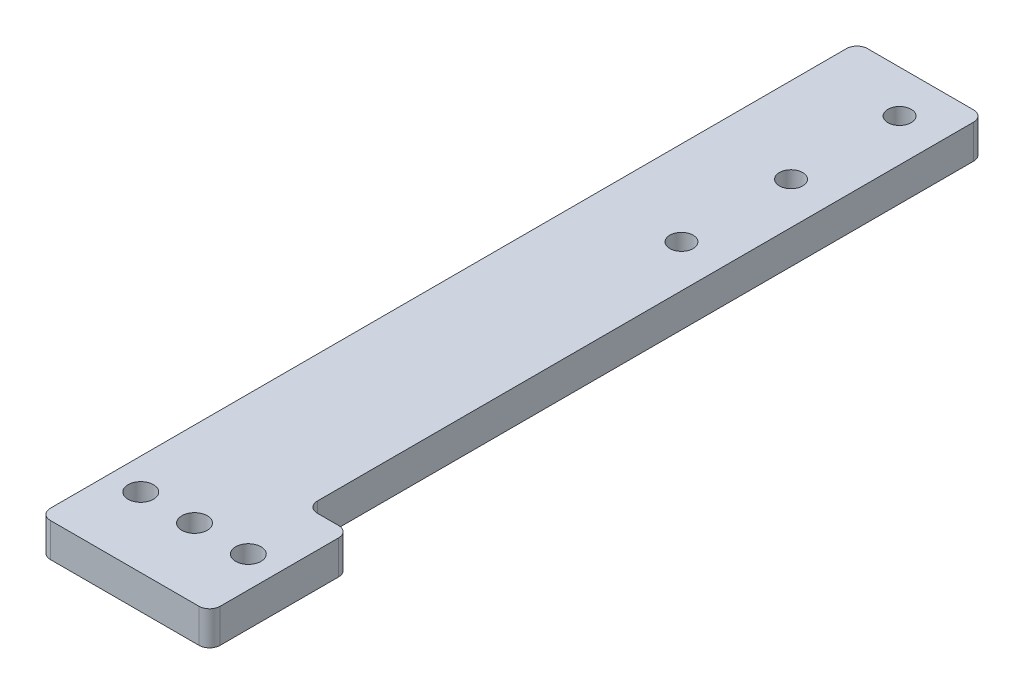
ISO-10303-21;
HEADER;
FILE_DESCRIPTION(('STEP AP214'),'2;1');
FILE_NAME('part.step','',(''),(''),'','','');
FILE_SCHEMA(('AUTOMOTIVE_DESIGN { 1 0 10303 214 1 1 1 1 }'));
ENDSEC;
DATA;
#1=APPLICATION_CONTEXT('core data for automotive mechanical design processes');
#2=APPLICATION_PROTOCOL_DEFINITION('international standard','automotive_design',2000,#1);
#3=PRODUCT_CONTEXT('',#1,'mechanical');
#4=PRODUCT('Part','Part','',(#3));
#5=PRODUCT_RELATED_PRODUCT_CATEGORY('part','',(#4));
#6=PRODUCT_DEFINITION_FORMATION('','',#4);
#7=PRODUCT_DEFINITION_CONTEXT('part definition',#1,'design');
#8=PRODUCT_DEFINITION('design','',#6,#7);
#9=PRODUCT_DEFINITION_SHAPE('','',#8);
#10=(LENGTH_UNIT() NAMED_UNIT(*) SI_UNIT(.MILLI.,.METRE.));
#11=(NAMED_UNIT(*) PLANE_ANGLE_UNIT() SI_UNIT($,.RADIAN.));
#12=(NAMED_UNIT(*) SI_UNIT($,.STERADIAN.) SOLID_ANGLE_UNIT());
#13=UNCERTAINTY_MEASURE_WITH_UNIT(LENGTH_MEASURE(1.E-05),#10,'distance_accuracy_value','');
#14=(GEOMETRIC_REPRESENTATION_CONTEXT(3) GLOBAL_UNCERTAINTY_ASSIGNED_CONTEXT((#13)) GLOBAL_UNIT_ASSIGNED_CONTEXT((#10,
#11,#12)) REPRESENTATION_CONTEXT('',''));
#15=CARTESIAN_POINT('',(0.,0.,0.));
#16=DIRECTION('',(0.,0.,1.));
#17=DIRECTION('',(1.,0.,0.));
#18=AXIS2_PLACEMENT_3D('',#15,#16,#17);
#19=CARTESIAN_POINT('',(0.,1.6,0.));
#20=DIRECTION('',(0.,-1.,0.));
#21=DIRECTION('',(0.,0.,-1.));
#22=AXIS2_PLACEMENT_3D('',#19,#20,#21);
#23=PLANE('',#22);
#24=CARTESIAN_POINT('',(2.54,1.6,19.3));
#25=DIRECTION('',(0.,1.,0.));
#26=DIRECTION('',(0.,0.,-1.));
#27=AXIS2_PLACEMENT_3D('',#24,#25,#26);
#28=CIRCLE('',#27,0.6);
#29=CARTESIAN_POINT('',(2.54,1.6,18.7));
#30=VERTEX_POINT('',#29);
#31=EDGE_CURVE('E359',#30,#30,#28,.T.);
#32=ORIENTED_EDGE('',*,*,#31,.F.);
#33=EDGE_LOOP('',(#32));
#34=FACE_BOUND('',#33,.T.);
#35=CARTESIAN_POINT('',(-2.54,1.6,19.3));
#36=DIRECTION('',(0.,1.,0.));
#37=DIRECTION('',(0.,0.,1.));
#38=AXIS2_PLACEMENT_3D('',#35,#36,#37);
#39=CIRCLE('',#38,0.6);
#40=CARTESIAN_POINT('',(-2.54,1.6,19.9));
#41=VERTEX_POINT('',#40);
#42=EDGE_CURVE('E350',#41,#41,#39,.T.);
#43=ORIENTED_EDGE('',*,*,#42,.F.);
#44=EDGE_LOOP('',(#43));
#45=FACE_BOUND('',#44,.T.);
#46=CARTESIAN_POINT('',(0.,1.6,19.3));
#47=DIRECTION('',(0.,1.,0.));
#48=DIRECTION('',(0.,0.,1.));
#49=AXIS2_PLACEMENT_3D('',#46,#47,#48);
#50=CIRCLE('',#49,0.6);
#51=CARTESIAN_POINT('',(0.,1.6,19.9));
#52=VERTEX_POINT('',#51);
#53=EDGE_CURVE('E356',#52,#52,#50,.T.);
#54=ORIENTED_EDGE('',*,*,#53,.F.);
#55=EDGE_LOOP('',(#54));
#56=FACE_BOUND('',#55,.T.);
#57=DIRECTION('',(-1.,0.,0.));
#58=VECTOR('',#57,1.);
#59=CARTESIAN_POINT('',(-2.,1.6,-16.));
#60=LINE('',#59,#58);
#61=CARTESIAN_POINT('',(1.5,1.6,-16.));
#62=VERTEX_POINT('',#61);
#63=CARTESIAN_POINT('',(-3.51,1.6,-16.));
#64=VERTEX_POINT('',#63);
#65=EDGE_CURVE('E202',#62,#64,#60,.T.);
#66=ORIENTED_EDGE('',*,*,#65,.T.);
#67=CARTESIAN_POINT('',(-3.51,1.6,-15.5));
#68=DIRECTION('',(0.,-1.,0.));
#69=DIRECTION('',(0.,0.,-1.));
#70=AXIS2_PLACEMENT_3D('',#67,#68,#69);
#71=CIRCLE('',#70,0.5);
#72=CARTESIAN_POINT('',(-4.01,1.6,-15.5));
#73=VERTEX_POINT('',#72);
#74=EDGE_CURVE('E240',#64,#73,#71,.F.);
#75=ORIENTED_EDGE('',*,*,#74,.T.);
#76=DIRECTION('',(0.,0.,1.));
#77=VECTOR('',#76,1.);
#78=CARTESIAN_POINT('',(-4.01,1.6,22.6));
#79=LINE('',#78,#77);
#80=CARTESIAN_POINT('',(-4.01,1.6,22.1));
#81=VERTEX_POINT('',#80);
#82=EDGE_CURVE('E151',#73,#81,#79,.T.);
#83=ORIENTED_EDGE('',*,*,#82,.T.);
#84=CARTESIAN_POINT('',(-3.51,1.6,22.1));
#85=DIRECTION('',(0.,-1.,0.));
#86=DIRECTION('',(0.,0.,-1.));
#87=AXIS2_PLACEMENT_3D('',#84,#85,#86);
#88=CIRCLE('',#87,0.5);
#89=CARTESIAN_POINT('',(-3.51,1.6,22.6));
#90=VERTEX_POINT('',#89);
#91=EDGE_CURVE('E237',#81,#90,#88,.F.);
#92=ORIENTED_EDGE('',*,*,#91,.T.);
#93=DIRECTION('',(1.,0.,0.));
#94=VECTOR('',#93,1.);
#95=CARTESIAN_POINT('',(4.01,1.6,22.6));
#96=LINE('',#95,#94);
#97=CARTESIAN_POINT('',(3.51,1.6,22.6));
#98=VERTEX_POINT('',#97);
#99=EDGE_CURVE('E181',#90,#98,#96,.T.);
#100=ORIENTED_EDGE('',*,*,#99,.T.);
#101=CARTESIAN_POINT('',(3.51,1.6,22.1));
#102=DIRECTION('',(0.,-1.,0.));
#103=DIRECTION('',(0.,0.,-1.));
#104=AXIS2_PLACEMENT_3D('',#101,#102,#103);
#105=CIRCLE('',#104,0.5);
#106=CARTESIAN_POINT('',(4.01,1.6,22.1));
#107=VERTEX_POINT('',#106);
#108=EDGE_CURVE('E234',#98,#107,#105,.F.);
#109=ORIENTED_EDGE('',*,*,#108,.T.);
#110=DIRECTION('',(0.,0.,-1.));
#111=VECTOR('',#110,1.);
#112=CARTESIAN_POINT('',(4.01,1.6,22.6));
#113=LINE('',#112,#111);
#114=CARTESIAN_POINT('',(4.01,1.6,16.5));
#115=VERTEX_POINT('',#114);
#116=EDGE_CURVE('E166',#107,#115,#113,.T.);
#117=ORIENTED_EDGE('',*,*,#116,.T.);
#118=CARTESIAN_POINT('',(3.51,1.6,16.5));
#119=DIRECTION('',(0.,-1.,0.));
#120=DIRECTION('',(0.,0.,-1.));
#121=AXIS2_PLACEMENT_3D('',#118,#119,#120);
#122=CIRCLE('',#121,0.5);
#123=CARTESIAN_POINT('',(3.51,1.6,16.));
#124=VERTEX_POINT('',#123);
#125=EDGE_CURVE('E62',#115,#124,#122,.F.);
#126=ORIENTED_EDGE('',*,*,#125,.T.);
#127=DIRECTION('',(-1.,0.,0.));
#128=VECTOR('',#127,1.);
#129=CARTESIAN_POINT('',(4.01,1.6,16.));
#130=LINE('',#129,#128);
#131=CARTESIAN_POINT('',(2.5,1.6,16.));
#132=VERTEX_POINT('',#131);
#133=EDGE_CURVE('E281',#124,#132,#130,.T.);
#134=ORIENTED_EDGE('',*,*,#133,.T.);
#135=CARTESIAN_POINT('',(2.5,1.6,15.5));
#136=DIRECTION('',(0.,-1.,0.));
#137=DIRECTION('',(0.,0.,-1.));
#138=AXIS2_PLACEMENT_3D('',#135,#136,#137);
#139=CIRCLE('',#138,0.5);
#140=CARTESIAN_POINT('',(2.,1.6,15.5));
#141=VERTEX_POINT('',#140);
#142=EDGE_CURVE('E11',#132,#141,#139,.T.);
#143=ORIENTED_EDGE('',*,*,#142,.T.);
#144=DIRECTION('',(0.,0.,-1.));
#145=VECTOR('',#144,1.);
#146=CARTESIAN_POINT('',(2.,1.6,16.));
#147=LINE('',#146,#145);
#148=CARTESIAN_POINT('',(2.,1.6,-15.5));
#149=VERTEX_POINT('',#148);
#150=EDGE_CURVE('E198',#141,#149,#147,.T.);
#151=ORIENTED_EDGE('',*,*,#150,.T.);
#152=CARTESIAN_POINT('',(1.5,1.6,-15.5));
#153=DIRECTION('',(0.,-1.,0.));
#154=DIRECTION('',(0.,0.,-1.));
#155=AXIS2_PLACEMENT_3D('',#152,#153,#154);
#156=CIRCLE('',#155,0.5);
#157=EDGE_CURVE('E229',#149,#62,#156,.F.);
#158=ORIENTED_EDGE('',*,*,#157,.T.);
#159=EDGE_LOOP('',(#66,#75,#83,#92,#100,#109,#117,#126,#134,#143,#151,#158));
#160=FACE_BOUND('',#159,.T.);
#161=CARTESIAN_POINT('',(0.0240948858415333,1.6,-8.85005636569911));
#162=DIRECTION('',(0.,1.,0.));
#163=DIRECTION('',(0.,0.,1.));
#164=AXIS2_PLACEMENT_3D('',#161,#162,#163);
#165=CIRCLE('',#164,0.55);
#166=CARTESIAN_POINT('',(0.0240948858415333,1.6,-8.30005636569911));
#167=VERTEX_POINT('',#166);
#168=EDGE_CURVE('E190',#167,#167,#165,.T.);
#169=ORIENTED_EDGE('',*,*,#168,.F.);
#170=EDGE_LOOP('',(#169));
#171=FACE_BOUND('',#170,.T.);
#172=CARTESIAN_POINT('',(0.,1.6,-14.));
#173=DIRECTION('',(0.,1.,0.));
#174=DIRECTION('',(0.,0.,1.));
#175=AXIS2_PLACEMENT_3D('',#172,#173,#174);
#176=CIRCLE('',#175,0.55);
#177=CARTESIAN_POINT('',(0.,1.6,-13.45));
#178=VERTEX_POINT('',#177);
#179=EDGE_CURVE('E182',#178,#178,#176,.T.);
#180=ORIENTED_EDGE('',*,*,#179,.F.);
#181=EDGE_LOOP('',(#180));
#182=FACE_BOUND('',#181,.T.);
#183=CARTESIAN_POINT('',(0.,1.6,-3.70011273139822));
#184=DIRECTION('',(0.,1.,0.));
#185=DIRECTION('',(0.,0.,-1.));
#186=AXIS2_PLACEMENT_3D('',#183,#184,#185);
#187=CIRCLE('',#186,0.55);
#188=CARTESIAN_POINT('',(0.,1.6,-4.25011273139822));
#189=VERTEX_POINT('',#188);
#190=EDGE_CURVE('E172',#189,#189,#187,.T.);
#191=ORIENTED_EDGE('',*,*,#190,.F.);
#192=EDGE_LOOP('',(#191));
#193=FACE_BOUND('',#192,.T.);
#194=ADVANCED_FACE('F39',(#34,#45,#56,#160,#171,#182,#193),#23,.F.);
#195=CARTESIAN_POINT('',(0.,0.,0.));
#196=DIRECTION('',(0.,-1.,0.));
#197=DIRECTION('',(0.,0.,-1.));
#198=AXIS2_PLACEMENT_3D('',#195,#196,#197);
#199=PLANE('',#198);
#200=CARTESIAN_POINT('',(2.54,0.,19.3));
#201=DIRECTION('',(0.,1.,0.));
#202=DIRECTION('',(0.,0.,-1.));
#203=AXIS2_PLACEMENT_3D('',#200,#201,#202);
#204=CIRCLE('',#203,0.6);
#205=CARTESIAN_POINT('',(2.54,0.,18.7));
#206=VERTEX_POINT('',#205);
#207=EDGE_CURVE('E352',#206,#206,#204,.T.);
#208=ORIENTED_EDGE('',*,*,#207,.T.);
#209=EDGE_LOOP('',(#208));
#210=FACE_BOUND('',#209,.T.);
#211=CARTESIAN_POINT('',(-2.54,0.,19.3));
#212=DIRECTION('',(0.,1.,0.));
#213=DIRECTION('',(0.,0.,1.));
#214=AXIS2_PLACEMENT_3D('',#211,#212,#213);
#215=CIRCLE('',#214,0.6);
#216=CARTESIAN_POINT('',(-2.54,0.,19.9));
#217=VERTEX_POINT('',#216);
#218=EDGE_CURVE('E347',#217,#217,#215,.T.);
#219=ORIENTED_EDGE('',*,*,#218,.T.);
#220=EDGE_LOOP('',(#219));
#221=FACE_BOUND('',#220,.T.);
#222=CARTESIAN_POINT('',(0.,0.,19.3));
#223=DIRECTION('',(0.,1.,0.));
#224=DIRECTION('',(0.,0.,1.));
#225=AXIS2_PLACEMENT_3D('',#222,#223,#224);
#226=CIRCLE('',#225,0.6);
#227=CARTESIAN_POINT('',(0.,0.,19.9));
#228=VERTEX_POINT('',#227);
#229=EDGE_CURVE('E365',#228,#228,#226,.T.);
#230=ORIENTED_EDGE('',*,*,#229,.T.);
#231=EDGE_LOOP('',(#230));
#232=FACE_BOUND('',#231,.T.);
#233=CARTESIAN_POINT('',(0.,0.,-14.));
#234=DIRECTION('',(0.,1.,0.));
#235=DIRECTION('',(0.,0.,1.));
#236=AXIS2_PLACEMENT_3D('',#233,#234,#235);
#237=CIRCLE('',#236,0.55);
#238=CARTESIAN_POINT('',(0.,0.,-13.45));
#239=VERTEX_POINT('',#238);
#240=EDGE_CURVE('E176',#239,#239,#237,.T.);
#241=ORIENTED_EDGE('',*,*,#240,.T.);
#242=EDGE_LOOP('',(#241));
#243=FACE_BOUND('',#242,.T.);
#244=DIRECTION('',(0.,0.,1.));
#245=VECTOR('',#244,1.);
#246=CARTESIAN_POINT('',(-4.01,0.,22.6));
#247=LINE('',#246,#245);
#248=CARTESIAN_POINT('',(-4.01,0.,-15.5));
#249=VERTEX_POINT('',#248);
#250=CARTESIAN_POINT('',(-4.01,0.,22.1));
#251=VERTEX_POINT('',#250);
#252=EDGE_CURVE('E148',#249,#251,#247,.T.);
#253=ORIENTED_EDGE('',*,*,#252,.F.);
#254=CARTESIAN_POINT('',(-3.51,0.,-15.5));
#255=DIRECTION('',(0.,-1.,0.));
#256=DIRECTION('',(0.,0.,-1.));
#257=AXIS2_PLACEMENT_3D('',#254,#255,#256);
#258=CIRCLE('',#257,0.5);
#259=CARTESIAN_POINT('',(-3.51,0.,-16.));
#260=VERTEX_POINT('',#259);
#261=EDGE_CURVE('E130',#249,#260,#258,.T.);
#262=ORIENTED_EDGE('',*,*,#261,.T.);
#263=DIRECTION('',(-1.,0.,0.));
#264=VECTOR('',#263,1.);
#265=CARTESIAN_POINT('',(-2.,0.,-16.));
#266=LINE('',#265,#264);
#267=CARTESIAN_POINT('',(1.5,0.,-16.));
#268=VERTEX_POINT('',#267);
#269=EDGE_CURVE('E203',#268,#260,#266,.T.);
#270=ORIENTED_EDGE('',*,*,#269,.F.);
#271=CARTESIAN_POINT('',(1.5,0.,-15.5));
#272=DIRECTION('',(0.,-1.,0.));
#273=DIRECTION('',(0.,0.,-1.));
#274=AXIS2_PLACEMENT_3D('',#271,#272,#273);
#275=CIRCLE('',#274,0.5);
#276=CARTESIAN_POINT('',(2.,0.,-15.5));
#277=VERTEX_POINT('',#276);
#278=EDGE_CURVE('E153',#268,#277,#275,.T.);
#279=ORIENTED_EDGE('',*,*,#278,.T.);
#280=DIRECTION('',(0.,0.,-1.));
#281=VECTOR('',#280,1.);
#282=CARTESIAN_POINT('',(2.,0.,16.));
#283=LINE('',#282,#281);
#284=CARTESIAN_POINT('',(2.,0.,15.5));
#285=VERTEX_POINT('',#284);
#286=EDGE_CURVE('E194',#285,#277,#283,.T.);
#287=ORIENTED_EDGE('',*,*,#286,.F.);
#288=CARTESIAN_POINT('',(2.5,0.,15.5));
#289=DIRECTION('',(0.,-1.,0.));
#290=DIRECTION('',(0.,0.,-1.));
#291=AXIS2_PLACEMENT_3D('',#288,#289,#290);
#292=CIRCLE('',#291,0.5);
#293=CARTESIAN_POINT('',(2.5,0.,16.));
#294=VERTEX_POINT('',#293);
#295=EDGE_CURVE('E48',#285,#294,#292,.F.);
#296=ORIENTED_EDGE('',*,*,#295,.T.);
#297=DIRECTION('',(-1.,0.,0.));
#298=VECTOR('',#297,1.);
#299=CARTESIAN_POINT('',(4.01,0.,16.));
#300=LINE('',#299,#298);
#301=CARTESIAN_POINT('',(3.51,0.,16.));
#302=VERTEX_POINT('',#301);
#303=EDGE_CURVE('E161',#302,#294,#300,.T.);
#304=ORIENTED_EDGE('',*,*,#303,.F.);
#305=CARTESIAN_POINT('',(3.51,0.,16.5));
#306=DIRECTION('',(0.,-1.,0.));
#307=DIRECTION('',(0.,0.,-1.));
#308=AXIS2_PLACEMENT_3D('',#305,#306,#307);
#309=CIRCLE('',#308,0.5);
#310=CARTESIAN_POINT('',(4.01,0.,16.5));
#311=VERTEX_POINT('',#310);
#312=EDGE_CURVE('E216',#302,#311,#309,.T.);
#313=ORIENTED_EDGE('',*,*,#312,.T.);
#314=DIRECTION('',(0.,0.,-1.));
#315=VECTOR('',#314,1.);
#316=CARTESIAN_POINT('',(4.01,0.,22.6));
#317=LINE('',#316,#315);
#318=CARTESIAN_POINT('',(4.01,0.,22.1));
#319=VERTEX_POINT('',#318);
#320=EDGE_CURVE('E168',#319,#311,#317,.T.);
#321=ORIENTED_EDGE('',*,*,#320,.F.);
#322=CARTESIAN_POINT('',(3.51,0.,22.1));
#323=DIRECTION('',(0.,-1.,0.));
#324=DIRECTION('',(0.,0.,-1.));
#325=AXIS2_PLACEMENT_3D('',#322,#323,#324);
#326=CIRCLE('',#325,0.5);
#327=CARTESIAN_POINT('',(3.51,0.,22.6));
#328=VERTEX_POINT('',#327);
#329=EDGE_CURVE('E219',#319,#328,#326,.T.);
#330=ORIENTED_EDGE('',*,*,#329,.T.);
#331=DIRECTION('',(1.,0.,0.));
#332=VECTOR('',#331,1.);
#333=CARTESIAN_POINT('',(4.01,0.,22.6));
#334=LINE('',#333,#332);
#335=CARTESIAN_POINT('',(-3.51,0.,22.6));
#336=VERTEX_POINT('',#335);
#337=EDGE_CURVE('E160',#336,#328,#334,.T.);
#338=ORIENTED_EDGE('',*,*,#337,.F.);
#339=CARTESIAN_POINT('',(-3.51,0.,22.1));
#340=DIRECTION('',(0.,-1.,0.));
#341=DIRECTION('',(0.,0.,-1.));
#342=AXIS2_PLACEMENT_3D('',#339,#340,#341);
#343=CIRCLE('',#342,0.5);
#344=EDGE_CURVE('E142',#336,#251,#343,.T.);
#345=ORIENTED_EDGE('',*,*,#344,.T.);
#346=EDGE_LOOP('',(#253,#262,#270,#279,#287,#296,#304,#313,#321,#330,#338,#345));
#347=FACE_BOUND('',#346,.T.);
#348=CARTESIAN_POINT('',(0.0240948858415333,0.,-8.85005636569911));
#349=DIRECTION('',(0.,1.,0.));
#350=DIRECTION('',(0.,0.,1.));
#351=AXIS2_PLACEMENT_3D('',#348,#349,#350);
#352=CIRCLE('',#351,0.55);
#353=CARTESIAN_POINT('',(0.0240948858415333,0.,-8.30005636569911));
#354=VERTEX_POINT('',#353);
#355=EDGE_CURVE('E186',#354,#354,#352,.T.);
#356=ORIENTED_EDGE('',*,*,#355,.T.);
#357=EDGE_LOOP('',(#356));
#358=FACE_BOUND('',#357,.T.);
#359=CARTESIAN_POINT('',(0.,0.,-3.70011273139822));
#360=DIRECTION('',(0.,1.,0.));
#361=DIRECTION('',(0.,0.,-1.));
#362=AXIS2_PLACEMENT_3D('',#359,#360,#361);
#363=CIRCLE('',#362,0.55);
#364=CARTESIAN_POINT('',(0.,0.,-4.25011273139822));
#365=VERTEX_POINT('',#364);
#366=EDGE_CURVE('E177',#365,#365,#363,.T.);
#367=ORIENTED_EDGE('',*,*,#366,.T.);
#368=EDGE_LOOP('',(#367));
#369=FACE_BOUND('',#368,.T.);
#370=ADVANCED_FACE('F156',(#210,#221,#232,#243,#347,#358,#369),#199,.T.);
#371=CARTESIAN_POINT('',(2.,1.6,16.));
#372=DIRECTION('',(-1.,0.,0.));
#373=DIRECTION('',(0.,0.,1.));
#374=AXIS2_PLACEMENT_3D('',#371,#372,#373);
#375=PLANE('',#374);
#376=ORIENTED_EDGE('',*,*,#150,.F.);
#377=DIRECTION('',(0.,-1.,0.));
#378=VECTOR('',#377,1.);
#379=CARTESIAN_POINT('',(2.,0.,15.5));
#380=LINE('',#379,#378);
#381=EDGE_CURVE('E266',#141,#285,#380,.T.);
#382=ORIENTED_EDGE('',*,*,#381,.T.);
#383=ORIENTED_EDGE('',*,*,#286,.T.);
#384=DIRECTION('',(0.,-1.,0.));
#385=VECTOR('',#384,1.);
#386=CARTESIAN_POINT('',(2.,1.6,-15.5));
#387=LINE('',#386,#385);
#388=EDGE_CURVE('E263',#277,#149,#387,.F.);
#389=ORIENTED_EDGE('',*,*,#388,.T.);
#390=EDGE_LOOP('',(#376,#382,#383,#389));
#391=FACE_BOUND('',#390,.T.);
#392=ADVANCED_FACE('F283',(#391),#375,.F.);
#393=CARTESIAN_POINT('',(-2.,1.6,-16.));
#394=DIRECTION('',(0.,0.,1.));
#395=DIRECTION('',(1.,0.,0.));
#396=AXIS2_PLACEMENT_3D('',#393,#394,#395);
#397=PLANE('',#396);
#398=ORIENTED_EDGE('',*,*,#269,.T.);
#399=DIRECTION('',(0.,-1.,0.));
#400=VECTOR('',#399,1.);
#401=CARTESIAN_POINT('',(-3.51,1.6,-16.));
#402=LINE('',#401,#400);
#403=EDGE_CURVE('E135',#260,#64,#402,.F.);
#404=ORIENTED_EDGE('',*,*,#403,.T.);
#405=ORIENTED_EDGE('',*,*,#65,.F.);
#406=DIRECTION('',(0.,-1.,0.));
#407=VECTOR('',#406,1.);
#408=CARTESIAN_POINT('',(1.5,1.6,-16.));
#409=LINE('',#408,#407);
#410=EDGE_CURVE('E141',#62,#268,#409,.T.);
#411=ORIENTED_EDGE('',*,*,#410,.T.);
#412=EDGE_LOOP('',(#398,#404,#405,#411));
#413=FACE_BOUND('',#412,.T.);
#414=ADVANCED_FACE('F289',(#413),#397,.F.);
#415=CARTESIAN_POINT('',(0.0240948858415333,1.6,-8.85005636569911));
#416=DIRECTION('',(0.,-1.,0.));
#417=DIRECTION('',(0.,0.,-1.));
#418=AXIS2_PLACEMENT_3D('',#415,#416,#417);
#419=CYLINDRICAL_SURFACE('',#418,0.55);
#420=ORIENTED_EDGE('',*,*,#168,.T.);
#421=EDGE_LOOP('',(#420));
#422=FACE_BOUND('',#421,.T.);
#423=ORIENTED_EDGE('',*,*,#355,.F.);
#424=EDGE_LOOP('',(#423));
#425=FACE_BOUND('',#424,.T.);
#426=ADVANCED_FACE('F291',(#422,#425),#419,.F.);
#427=CARTESIAN_POINT('',(0.,1.6,-14.));
#428=DIRECTION('',(0.,-1.,0.));
#429=DIRECTION('',(0.,0.,-1.));
#430=AXIS2_PLACEMENT_3D('',#427,#428,#429);
#431=CYLINDRICAL_SURFACE('',#430,0.55);
#432=ORIENTED_EDGE('',*,*,#179,.T.);
#433=EDGE_LOOP('',(#432));
#434=FACE_BOUND('',#433,.T.);
#435=ORIENTED_EDGE('',*,*,#240,.F.);
#436=EDGE_LOOP('',(#435));
#437=FACE_BOUND('',#436,.T.);
#438=ADVANCED_FACE('F297',(#434,#437),#431,.F.);
#439=CARTESIAN_POINT('',(0.,1.6,-3.70011273139822));
#440=DIRECTION('',(0.,-1.,0.));
#441=DIRECTION('',(0.,0.,-1.));
#442=AXIS2_PLACEMENT_3D('',#439,#440,#441);
#443=CYLINDRICAL_SURFACE('',#442,0.55);
#444=ORIENTED_EDGE('',*,*,#190,.T.);
#445=EDGE_LOOP('',(#444));
#446=FACE_BOUND('',#445,.T.);
#447=ORIENTED_EDGE('',*,*,#366,.F.);
#448=EDGE_LOOP('',(#447));
#449=FACE_BOUND('',#448,.T.);
#450=ADVANCED_FACE('F314',(#446,#449),#443,.F.);
#451=CARTESIAN_POINT('',(4.01,1.6,22.6));
#452=DIRECTION('',(-1.,0.,0.));
#453=DIRECTION('',(0.,0.,1.));
#454=AXIS2_PLACEMENT_3D('',#451,#452,#453);
#455=PLANE('',#454);
#456=ORIENTED_EDGE('',*,*,#116,.F.);
#457=DIRECTION('',(0.,-1.,0.));
#458=VECTOR('',#457,1.);
#459=CARTESIAN_POINT('',(4.01,1.6,22.1));
#460=LINE('',#459,#458);
#461=EDGE_CURVE('E253',#107,#319,#460,.T.);
#462=ORIENTED_EDGE('',*,*,#461,.T.);
#463=ORIENTED_EDGE('',*,*,#320,.T.);
#464=DIRECTION('',(0.,-1.,0.));
#465=VECTOR('',#464,1.);
#466=CARTESIAN_POINT('',(4.01,1.6,16.5));
#467=LINE('',#466,#465);
#468=EDGE_CURVE('E250',#311,#115,#467,.F.);
#469=ORIENTED_EDGE('',*,*,#468,.T.);
#470=EDGE_LOOP('',(#456,#462,#463,#469));
#471=FACE_BOUND('',#470,.T.);
#472=ADVANCED_FACE('F318',(#471),#455,.F.);
#473=CARTESIAN_POINT('',(4.01,1.6,16.));
#474=DIRECTION('',(0.,0.,1.));
#475=DIRECTION('',(1.,0.,0.));
#476=AXIS2_PLACEMENT_3D('',#473,#474,#475);
#477=PLANE('',#476);
#478=ORIENTED_EDGE('',*,*,#133,.F.);
#479=DIRECTION('',(0.,-1.,0.));
#480=VECTOR('',#479,1.);
#481=CARTESIAN_POINT('',(3.51,1.6,16.));
#482=LINE('',#481,#480);
#483=EDGE_CURVE('E259',#124,#302,#482,.T.);
#484=ORIENTED_EDGE('',*,*,#483,.T.);
#485=ORIENTED_EDGE('',*,*,#303,.T.);
#486=DIRECTION('',(0.,-1.,0.));
#487=VECTOR('',#486,1.);
#488=CARTESIAN_POINT('',(2.5,1.6,16.));
#489=LINE('',#488,#487);
#490=EDGE_CURVE('E55',#294,#132,#489,.F.);
#491=ORIENTED_EDGE('',*,*,#490,.T.);
#492=EDGE_LOOP('',(#478,#484,#485,#491));
#493=FACE_BOUND('',#492,.T.);
#494=ADVANCED_FACE('F274',(#493),#477,.F.);
#495=CARTESIAN_POINT('',(-4.01,1.6,22.6));
#496=DIRECTION('',(1.,0.,0.));
#497=DIRECTION('',(0.,0.,-1.));
#498=AXIS2_PLACEMENT_3D('',#495,#496,#497);
#499=PLANE('',#498);
#500=ORIENTED_EDGE('',*,*,#82,.F.);
#501=DIRECTION('',(0.,-1.,0.));
#502=VECTOR('',#501,1.);
#503=CARTESIAN_POINT('',(-4.01,1.6,-15.5));
#504=LINE('',#503,#502);
#505=EDGE_CURVE('E134',#73,#249,#504,.T.);
#506=ORIENTED_EDGE('',*,*,#505,.T.);
#507=ORIENTED_EDGE('',*,*,#252,.T.);
#508=DIRECTION('',(0.,-1.,0.));
#509=VECTOR('',#508,1.);
#510=CARTESIAN_POINT('',(-4.01,1.6,22.1));
#511=LINE('',#510,#509);
#512=EDGE_CURVE('E154',#251,#81,#511,.F.);
#513=ORIENTED_EDGE('',*,*,#512,.T.);
#514=EDGE_LOOP('',(#500,#506,#507,#513));
#515=FACE_BOUND('',#514,.T.);
#516=ADVANCED_FACE('F147',(#515),#499,.F.);
#517=CARTESIAN_POINT('',(4.01,1.6,22.6));
#518=DIRECTION('',(0.,0.,-1.));
#519=DIRECTION('',(-1.,0.,0.));
#520=AXIS2_PLACEMENT_3D('',#517,#518,#519);
#521=PLANE('',#520);
#522=ORIENTED_EDGE('',*,*,#99,.F.);
#523=DIRECTION('',(0.,-1.,0.));
#524=VECTOR('',#523,1.);
#525=CARTESIAN_POINT('',(-3.51,1.6,22.6));
#526=LINE('',#525,#524);
#527=EDGE_CURVE('E246',#90,#336,#526,.T.);
#528=ORIENTED_EDGE('',*,*,#527,.T.);
#529=ORIENTED_EDGE('',*,*,#337,.T.);
#530=DIRECTION('',(0.,-1.,0.));
#531=VECTOR('',#530,1.);
#532=CARTESIAN_POINT('',(3.51,1.6,22.6));
#533=LINE('',#532,#531);
#534=EDGE_CURVE('E243',#328,#98,#533,.F.);
#535=ORIENTED_EDGE('',*,*,#534,.T.);
#536=EDGE_LOOP('',(#522,#528,#529,#535));
#537=FACE_BOUND('',#536,.T.);
#538=ADVANCED_FACE('F327',(#537),#521,.F.);
#539=CARTESIAN_POINT('',(0.,0.,19.3));
#540=DIRECTION('',(0.,1.,0.));
#541=DIRECTION('',(0.,0.,1.));
#542=AXIS2_PLACEMENT_3D('',#539,#540,#541);
#543=CYLINDRICAL_SURFACE('',#542,0.6);
#544=ORIENTED_EDGE('',*,*,#229,.F.);
#545=EDGE_LOOP('',(#544));
#546=FACE_BOUND('',#545,.T.);
#547=ORIENTED_EDGE('',*,*,#53,.T.);
#548=EDGE_LOOP('',(#547));
#549=FACE_BOUND('',#548,.T.);
#550=ADVANCED_FACE('F330',(#546,#549),#543,.F.);
#551=CARTESIAN_POINT('',(-2.54,0.,19.3));
#552=DIRECTION('',(0.,1.,0.));
#553=DIRECTION('',(0.,0.,1.));
#554=AXIS2_PLACEMENT_3D('',#551,#552,#553);
#555=CYLINDRICAL_SURFACE('',#554,0.6);
#556=ORIENTED_EDGE('',*,*,#218,.F.);
#557=EDGE_LOOP('',(#556));
#558=FACE_BOUND('',#557,.T.);
#559=ORIENTED_EDGE('',*,*,#42,.T.);
#560=EDGE_LOOP('',(#559));
#561=FACE_BOUND('',#560,.T.);
#562=ADVANCED_FACE('F334',(#558,#561),#555,.F.);
#563=CARTESIAN_POINT('',(2.54,0.,19.3));
#564=DIRECTION('',(0.,1.,0.));
#565=DIRECTION('',(0.,0.,1.));
#566=AXIS2_PLACEMENT_3D('',#563,#564,#565);
#567=CYLINDRICAL_SURFACE('',#566,0.6);
#568=ORIENTED_EDGE('',*,*,#207,.F.);
#569=EDGE_LOOP('',(#568));
#570=FACE_BOUND('',#569,.T.);
#571=ORIENTED_EDGE('',*,*,#31,.T.);
#572=EDGE_LOOP('',(#571));
#573=FACE_BOUND('',#572,.T.);
#574=ADVANCED_FACE('F336',(#570,#573),#567,.F.);
#575=CARTESIAN_POINT('',(-3.51,1.6,-15.5));
#576=DIRECTION('',(0.,-1.,0.));
#577=DIRECTION('',(0.,0.,-1.));
#578=AXIS2_PLACEMENT_3D('',#575,#576,#577);
#579=CYLINDRICAL_SURFACE('',#578,0.5);
#580=ORIENTED_EDGE('',*,*,#74,.F.);
#581=ORIENTED_EDGE('',*,*,#403,.F.);
#582=ORIENTED_EDGE('',*,*,#261,.F.);
#583=ORIENTED_EDGE('',*,*,#505,.F.);
#584=EDGE_LOOP('',(#580,#581,#582,#583));
#585=FACE_BOUND('',#584,.T.);
#586=ADVANCED_FACE('F133',(#585),#579,.T.);
#587=CARTESIAN_POINT('',(-3.51,1.6,22.1));
#588=DIRECTION('',(0.,-1.,0.));
#589=DIRECTION('',(0.,0.,-1.));
#590=AXIS2_PLACEMENT_3D('',#587,#588,#589);
#591=CYLINDRICAL_SURFACE('',#590,0.5);
#592=ORIENTED_EDGE('',*,*,#91,.F.);
#593=ORIENTED_EDGE('',*,*,#512,.F.);
#594=ORIENTED_EDGE('',*,*,#344,.F.);
#595=ORIENTED_EDGE('',*,*,#527,.F.);
#596=EDGE_LOOP('',(#592,#593,#594,#595));
#597=FACE_BOUND('',#596,.T.);
#598=ADVANCED_FACE('F395',(#597),#591,.T.);
#599=CARTESIAN_POINT('',(3.51,1.6,22.1));
#600=DIRECTION('',(0.,-1.,0.));
#601=DIRECTION('',(0.,0.,-1.));
#602=AXIS2_PLACEMENT_3D('',#599,#600,#601);
#603=CYLINDRICAL_SURFACE('',#602,0.5);
#604=ORIENTED_EDGE('',*,*,#108,.F.);
#605=ORIENTED_EDGE('',*,*,#534,.F.);
#606=ORIENTED_EDGE('',*,*,#329,.F.);
#607=ORIENTED_EDGE('',*,*,#461,.F.);
#608=EDGE_LOOP('',(#604,#605,#606,#607));
#609=FACE_BOUND('',#608,.T.);
#610=ADVANCED_FACE('F389',(#609),#603,.T.);
#611=CARTESIAN_POINT('',(3.51,1.6,16.5));
#612=DIRECTION('',(0.,-1.,0.));
#613=DIRECTION('',(0.,0.,-1.));
#614=AXIS2_PLACEMENT_3D('',#611,#612,#613);
#615=CYLINDRICAL_SURFACE('',#614,0.5);
#616=ORIENTED_EDGE('',*,*,#125,.F.);
#617=ORIENTED_EDGE('',*,*,#468,.F.);
#618=ORIENTED_EDGE('',*,*,#312,.F.);
#619=ORIENTED_EDGE('',*,*,#483,.F.);
#620=EDGE_LOOP('',(#616,#617,#618,#619));
#621=FACE_BOUND('',#620,.T.);
#622=ADVANCED_FACE('F387',(#621),#615,.T.);
#623=CARTESIAN_POINT('',(2.5,1.6,15.5));
#624=DIRECTION('',(0.,1.,0.));
#625=DIRECTION('',(0.,0.,1.));
#626=AXIS2_PLACEMENT_3D('',#623,#624,#625);
#627=CYLINDRICAL_SURFACE('',#626,0.5);
#628=ORIENTED_EDGE('',*,*,#142,.F.);
#629=ORIENTED_EDGE('',*,*,#490,.F.);
#630=ORIENTED_EDGE('',*,*,#295,.F.);
#631=ORIENTED_EDGE('',*,*,#381,.F.);
#632=EDGE_LOOP('',(#628,#629,#630,#631));
#633=FACE_BOUND('',#632,.T.);
#634=ADVANCED_FACE('F277',(#633),#627,.F.);
#635=CARTESIAN_POINT('',(1.5,1.6,-15.5));
#636=DIRECTION('',(0.,-1.,0.));
#637=DIRECTION('',(0.,0.,-1.));
#638=AXIS2_PLACEMENT_3D('',#635,#636,#637);
#639=CYLINDRICAL_SURFACE('',#638,0.5);
#640=ORIENTED_EDGE('',*,*,#157,.F.);
#641=ORIENTED_EDGE('',*,*,#388,.F.);
#642=ORIENTED_EDGE('',*,*,#278,.F.);
#643=ORIENTED_EDGE('',*,*,#410,.F.);
#644=EDGE_LOOP('',(#640,#641,#642,#643));
#645=FACE_BOUND('',#644,.T.);
#646=ADVANCED_FACE('F41',(#645),#639,.T.);
#647=CLOSED_SHELL('',(#194,#370,#392,#414,#426,#438,#450,#472,#494,#516,#538,#550,#562,#574,
#586,#598,#610,#622,#634,#646));
#648=MANIFOLD_SOLID_BREP('B2',#647);
#649=ADVANCED_BREP_SHAPE_REPRESENTATION('',(#18,#648),#14);
#650=SHAPE_DEFINITION_REPRESENTATION(#9,#649);
ENDSEC;
END-ISO-10303-21;
